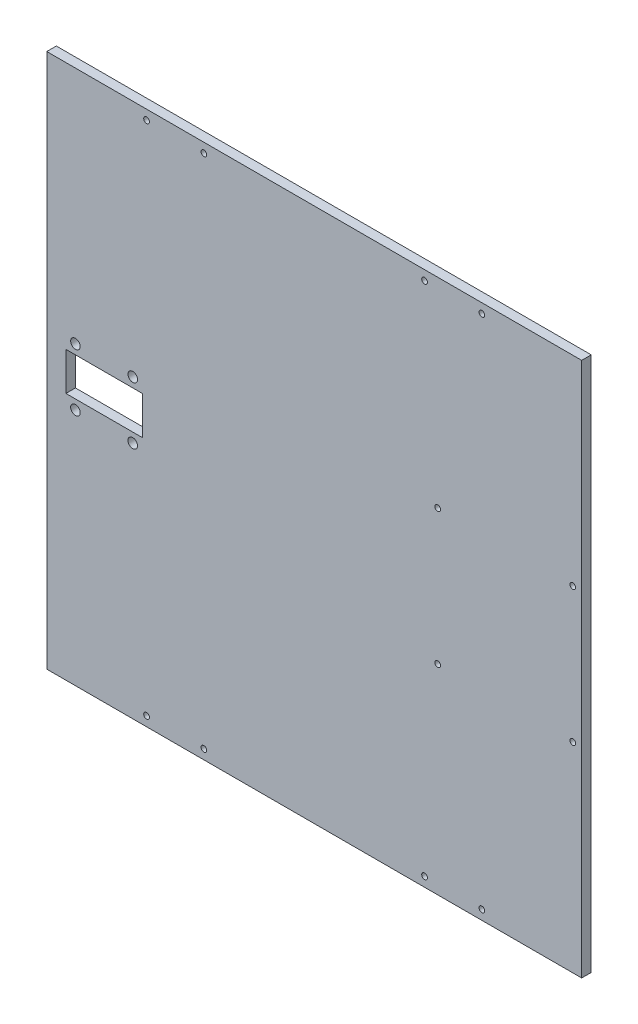
ISO-10303-21;
HEADER;
FILE_DESCRIPTION(('STEP AP214'),'2;1');
FILE_NAME('part.step','',(''),(''),'','','');
FILE_SCHEMA(('AUTOMOTIVE_DESIGN { 1 0 10303 214 1 1 1 1 }'));
ENDSEC;
DATA;
#1=APPLICATION_CONTEXT('core data for automotive mechanical design processes');
#2=APPLICATION_PROTOCOL_DEFINITION('international standard','automotive_design',2000,#1);
#3=PRODUCT_CONTEXT('',#1,'mechanical');
#4=PRODUCT('Part','Part','',(#3));
#5=PRODUCT_RELATED_PRODUCT_CATEGORY('part','',(#4));
#6=PRODUCT_DEFINITION_FORMATION('','',#4);
#7=PRODUCT_DEFINITION_CONTEXT('part definition',#1,'design');
#8=PRODUCT_DEFINITION('design','',#6,#7);
#9=PRODUCT_DEFINITION_SHAPE('','',#8);
#10=(LENGTH_UNIT() NAMED_UNIT(*) SI_UNIT(.MILLI.,.METRE.));
#11=(NAMED_UNIT(*) PLANE_ANGLE_UNIT() SI_UNIT($,.RADIAN.));
#12=(NAMED_UNIT(*) SI_UNIT($,.STERADIAN.) SOLID_ANGLE_UNIT());
#13=UNCERTAINTY_MEASURE_WITH_UNIT(LENGTH_MEASURE(1.E-05),#10,'distance_accuracy_value','');
#14=(GEOMETRIC_REPRESENTATION_CONTEXT(3) GLOBAL_UNCERTAINTY_ASSIGNED_CONTEXT((#13)) GLOBAL_UNIT_ASSIGNED_CONTEXT((#10,
#11,#12)) REPRESENTATION_CONTEXT('',''));
#15=CARTESIAN_POINT('',(0.,0.,0.));
#16=DIRECTION('',(0.,0.,1.));
#17=DIRECTION('',(1.,0.,0.));
#18=AXIS2_PLACEMENT_3D('',#15,#16,#17);
#19=CARTESIAN_POINT('',(0.,0.,5.));
#20=DIRECTION('',(0.,0.,-1.));
#21=DIRECTION('',(-1.,0.,0.));
#22=AXIS2_PLACEMENT_3D('',#19,#20,#21);
#23=PLANE('',#22);
#24=CARTESIAN_POINT('',(-95.,-15.,5.));
#25=DIRECTION('',(0.,0.,1.));
#26=DIRECTION('',(1.,0.,0.));
#27=AXIS2_PLACEMENT_3D('',#24,#25,#26);
#28=CIRCLE('',#27,2.49999999999999);
#29=CARTESIAN_POINT('',(-92.5,-15.,5.));
#30=VERTEX_POINT('',#29);
#31=EDGE_CURVE('E137',#30,#30,#28,.T.);
#32=ORIENTED_EDGE('',*,*,#31,.F.);
#33=EDGE_LOOP('',(#32));
#34=FACE_BOUND('',#33,.T.);
#35=CARTESIAN_POINT('',(-125.,-15.,5.));
#36=DIRECTION('',(0.,0.,1.));
#37=DIRECTION('',(1.,0.,0.));
#38=AXIS2_PLACEMENT_3D('',#35,#36,#37);
#39=CIRCLE('',#38,2.5);
#40=CARTESIAN_POINT('',(-122.5,-15.,5.));
#41=VERTEX_POINT('',#40);
#42=EDGE_CURVE('E143',#41,#41,#39,.T.);
#43=ORIENTED_EDGE('',*,*,#42,.F.);
#44=EDGE_LOOP('',(#43));
#45=FACE_BOUND('',#44,.T.);
#46=CARTESIAN_POINT('',(-125.,15.,5.));
#47=DIRECTION('',(0.,0.,1.));
#48=DIRECTION('',(1.,0.,0.));
#49=AXIS2_PLACEMENT_3D('',#46,#47,#48);
#50=CIRCLE('',#49,2.5);
#51=CARTESIAN_POINT('',(-122.5,15.,5.));
#52=VERTEX_POINT('',#51);
#53=EDGE_CURVE('E149',#52,#52,#50,.T.);
#54=ORIENTED_EDGE('',*,*,#53,.F.);
#55=EDGE_LOOP('',(#54));
#56=FACE_BOUND('',#55,.T.);
#57=CARTESIAN_POINT('',(-95.,15.,5.));
#58=DIRECTION('',(0.,0.,1.));
#59=DIRECTION('',(1.,0.,0.));
#60=AXIS2_PLACEMENT_3D('',#57,#58,#59);
#61=CIRCLE('',#60,2.50000000000001);
#62=CARTESIAN_POINT('',(-92.5,15.,5.));
#63=VERTEX_POINT('',#62);
#64=EDGE_CURVE('E155',#63,#63,#61,.T.);
#65=ORIENTED_EDGE('',*,*,#64,.F.);
#66=EDGE_LOOP('',(#65));
#67=FACE_BOUND('',#66,.T.);
#68=CARTESIAN_POINT('',(135.355339059327,-35.3553390593273,5.));
#69=DIRECTION('',(0.,0.,1.));
#70=DIRECTION('',(1.,0.,0.));
#71=AXIS2_PLACEMENT_3D('',#68,#69,#70);
#72=CIRCLE('',#71,1.5);
#73=CARTESIAN_POINT('',(136.855339059327,-35.3553390593273,5.));
#74=VERTEX_POINT('',#73);
#75=EDGE_CURVE('E161',#74,#74,#72,.T.);
#76=ORIENTED_EDGE('',*,*,#75,.F.);
#77=EDGE_LOOP('',(#76));
#78=FACE_BOUND('',#77,.T.);
#79=CARTESIAN_POINT('',(64.6446609406726,-35.3553390593274,5.));
#80=DIRECTION('',(0.,0.,1.));
#81=DIRECTION('',(1.,0.,0.));
#82=AXIS2_PLACEMENT_3D('',#79,#80,#81);
#83=CIRCLE('',#82,1.5);
#84=CARTESIAN_POINT('',(66.1446609406726,-35.3553390593274,5.));
#85=VERTEX_POINT('',#84);
#86=EDGE_CURVE('E167',#85,#85,#83,.T.);
#87=ORIENTED_EDGE('',*,*,#86,.F.);
#88=EDGE_LOOP('',(#87));
#89=FACE_BOUND('',#88,.T.);
#90=CARTESIAN_POINT('',(64.6446609406726,35.3553390593274,5.));
#91=DIRECTION('',(0.,0.,1.));
#92=DIRECTION('',(1.,0.,0.));
#93=AXIS2_PLACEMENT_3D('',#90,#91,#92);
#94=CIRCLE('',#93,1.5);
#95=CARTESIAN_POINT('',(66.1446609406726,35.3553390593274,5.));
#96=VERTEX_POINT('',#95);
#97=EDGE_CURVE('E173',#96,#96,#94,.T.);
#98=ORIENTED_EDGE('',*,*,#97,.F.);
#99=EDGE_LOOP('',(#98));
#100=FACE_BOUND('',#99,.T.);
#101=CARTESIAN_POINT('',(135.355339059327,35.3553390593274,5.));
#102=DIRECTION('',(0.,0.,1.));
#103=DIRECTION('',(1.,0.,0.));
#104=AXIS2_PLACEMENT_3D('',#101,#102,#103);
#105=CIRCLE('',#104,1.5);
#106=CARTESIAN_POINT('',(136.855339059327,35.3553390593274,5.));
#107=VERTEX_POINT('',#106);
#108=EDGE_CURVE('E179',#107,#107,#105,.T.);
#109=ORIENTED_EDGE('',*,*,#108,.F.);
#110=EDGE_LOOP('',(#109));
#111=FACE_BOUND('',#110,.T.);
#112=CARTESIAN_POINT('',(-87.76,-135.,5.));
#113=DIRECTION('',(0.,0.,1.));
#114=DIRECTION('',(-1.,0.,0.));
#115=AXIS2_PLACEMENT_3D('',#112,#113,#114);
#116=CIRCLE('',#115,1.5);
#117=CARTESIAN_POINT('',(-89.26,-135.,5.));
#118=VERTEX_POINT('',#117);
#119=EDGE_CURVE('E185',#118,#118,#116,.T.);
#120=ORIENTED_EDGE('',*,*,#119,.F.);
#121=EDGE_LOOP('',(#120));
#122=FACE_BOUND('',#121,.T.);
#123=CARTESIAN_POINT('',(-57.76,-135.,5.));
#124=DIRECTION('',(0.,0.,1.));
#125=DIRECTION('',(-1.,0.,0.));
#126=AXIS2_PLACEMENT_3D('',#123,#124,#125);
#127=CIRCLE('',#126,1.5);
#128=CARTESIAN_POINT('',(-59.26,-135.,5.));
#129=VERTEX_POINT('',#128);
#130=EDGE_CURVE('E191',#129,#129,#127,.T.);
#131=ORIENTED_EDGE('',*,*,#130,.F.);
#132=EDGE_LOOP('',(#131));
#133=FACE_BOUND('',#132,.T.);
#134=CARTESIAN_POINT('',(57.76,-135.,5.));
#135=DIRECTION('',(0.,0.,1.));
#136=DIRECTION('',(1.,0.,0.));
#137=AXIS2_PLACEMENT_3D('',#134,#135,#136);
#138=CIRCLE('',#137,1.5);
#139=CARTESIAN_POINT('',(59.26,-135.,5.));
#140=VERTEX_POINT('',#139);
#141=EDGE_CURVE('E197',#140,#140,#138,.T.);
#142=ORIENTED_EDGE('',*,*,#141,.F.);
#143=EDGE_LOOP('',(#142));
#144=FACE_BOUND('',#143,.T.);
#145=CARTESIAN_POINT('',(87.76,-135.,5.));
#146=DIRECTION('',(0.,0.,1.));
#147=DIRECTION('',(1.,0.,0.));
#148=AXIS2_PLACEMENT_3D('',#145,#146,#147);
#149=CIRCLE('',#148,1.5);
#150=CARTESIAN_POINT('',(89.26,-135.,5.));
#151=VERTEX_POINT('',#150);
#152=EDGE_CURVE('E203',#151,#151,#149,.T.);
#153=ORIENTED_EDGE('',*,*,#152,.F.);
#154=EDGE_LOOP('',(#153));
#155=FACE_BOUND('',#154,.T.);
#156=CARTESIAN_POINT('',(87.76,135.,5.));
#157=DIRECTION('',(0.,0.,1.));
#158=DIRECTION('',(-1.,0.,0.));
#159=AXIS2_PLACEMENT_3D('',#156,#157,#158);
#160=CIRCLE('',#159,1.5);
#161=CARTESIAN_POINT('',(86.26,135.,5.));
#162=VERTEX_POINT('',#161);
#163=EDGE_CURVE('E209',#162,#162,#160,.T.);
#164=ORIENTED_EDGE('',*,*,#163,.F.);
#165=EDGE_LOOP('',(#164));
#166=FACE_BOUND('',#165,.T.);
#167=CARTESIAN_POINT('',(57.76,135.,5.));
#168=DIRECTION('',(0.,0.,1.));
#169=DIRECTION('',(-1.,0.,0.));
#170=AXIS2_PLACEMENT_3D('',#167,#168,#169);
#171=CIRCLE('',#170,1.5);
#172=CARTESIAN_POINT('',(56.26,135.,5.));
#173=VERTEX_POINT('',#172);
#174=EDGE_CURVE('E215',#173,#173,#171,.T.);
#175=ORIENTED_EDGE('',*,*,#174,.F.);
#176=EDGE_LOOP('',(#175));
#177=FACE_BOUND('',#176,.T.);
#178=CARTESIAN_POINT('',(-57.76,135.,5.));
#179=DIRECTION('',(0.,0.,1.));
#180=DIRECTION('',(1.,0.,0.));
#181=AXIS2_PLACEMENT_3D('',#178,#179,#180);
#182=CIRCLE('',#181,1.5);
#183=CARTESIAN_POINT('',(-56.26,135.,5.));
#184=VERTEX_POINT('',#183);
#185=EDGE_CURVE('E221',#184,#184,#182,.T.);
#186=ORIENTED_EDGE('',*,*,#185,.F.);
#187=EDGE_LOOP('',(#186));
#188=FACE_BOUND('',#187,.T.);
#189=CARTESIAN_POINT('',(-87.76,135.,5.));
#190=DIRECTION('',(0.,0.,1.));
#191=DIRECTION('',(1.,0.,0.));
#192=AXIS2_PLACEMENT_3D('',#189,#190,#191);
#193=CIRCLE('',#192,1.5);
#194=CARTESIAN_POINT('',(-86.26,135.,5.));
#195=VERTEX_POINT('',#194);
#196=EDGE_CURVE('E227',#195,#195,#193,.T.);
#197=ORIENTED_EDGE('',*,*,#196,.F.);
#198=EDGE_LOOP('',(#197));
#199=FACE_BOUND('',#198,.T.);
#200=DIRECTION('',(0.,1.,0.));
#201=VECTOR('',#200,1.);
#202=CARTESIAN_POINT('',(140.,-140.,5.));
#203=LINE('',#202,#201);
#204=CARTESIAN_POINT('',(140.,-140.,5.));
#205=VERTEX_POINT('',#204);
#206=CARTESIAN_POINT('',(140.,140.,5.));
#207=VERTEX_POINT('',#206);
#208=EDGE_CURVE('E233',#205,#207,#203,.T.);
#209=ORIENTED_EDGE('',*,*,#208,.T.);
#210=DIRECTION('',(-1.,0.,0.));
#211=VECTOR('',#210,1.);
#212=CARTESIAN_POINT('',(-140.,140.,5.));
#213=LINE('',#212,#211);
#214=CARTESIAN_POINT('',(-140.,140.,5.));
#215=VERTEX_POINT('',#214);
#216=EDGE_CURVE('E236',#207,#215,#213,.T.);
#217=ORIENTED_EDGE('',*,*,#216,.T.);
#218=DIRECTION('',(0.,-1.,0.));
#219=VECTOR('',#218,1.);
#220=CARTESIAN_POINT('',(-140.,-140.,5.));
#221=LINE('',#220,#219);
#222=CARTESIAN_POINT('',(-140.,-140.,5.));
#223=VERTEX_POINT('',#222);
#224=EDGE_CURVE('E239',#215,#223,#221,.T.);
#225=ORIENTED_EDGE('',*,*,#224,.T.);
#226=DIRECTION('',(1.,0.,0.));
#227=VECTOR('',#226,1.);
#228=CARTESIAN_POINT('',(-140.,-140.,5.));
#229=LINE('',#228,#227);
#230=EDGE_CURVE('E241',#223,#205,#229,.T.);
#231=ORIENTED_EDGE('',*,*,#230,.T.);
#232=EDGE_LOOP('',(#209,#217,#225,#231));
#233=FACE_BOUND('',#232,.T.);
#234=DIRECTION('',(0.,1.,0.));
#235=VECTOR('',#234,1.);
#236=CARTESIAN_POINT('',(-90.,9.99999999999999,5.));
#237=LINE('',#236,#235);
#238=CARTESIAN_POINT('',(-90.,-10.,5.));
#239=VERTEX_POINT('',#238);
#240=CARTESIAN_POINT('',(-90.,9.99999999999999,5.));
#241=VERTEX_POINT('',#240);
#242=EDGE_CURVE('E101',#239,#241,#237,.T.);
#243=ORIENTED_EDGE('',*,*,#242,.F.);
#244=DIRECTION('',(1.,0.,0.));
#245=VECTOR('',#244,1.);
#246=CARTESIAN_POINT('',(-90.,-10.,5.));
#247=LINE('',#246,#245);
#248=CARTESIAN_POINT('',(-130.,-10.,5.));
#249=VERTEX_POINT('',#248);
#250=EDGE_CURVE('E123',#249,#239,#247,.T.);
#251=ORIENTED_EDGE('',*,*,#250,.F.);
#252=DIRECTION('',(0.,-1.,0.));
#253=VECTOR('',#252,1.);
#254=CARTESIAN_POINT('',(-130.,9.99999999999998,5.));
#255=LINE('',#254,#253);
#256=CARTESIAN_POINT('',(-130.,9.99999999999998,5.));
#257=VERTEX_POINT('',#256);
#258=EDGE_CURVE('E121',#257,#249,#255,.T.);
#259=ORIENTED_EDGE('',*,*,#258,.F.);
#260=DIRECTION('',(-1.,0.,0.));
#261=VECTOR('',#260,1.);
#262=CARTESIAN_POINT('',(-90.,9.99999999999999,5.));
#263=LINE('',#262,#261);
#264=EDGE_CURVE('E109',#241,#257,#263,.T.);
#265=ORIENTED_EDGE('',*,*,#264,.F.);
#266=EDGE_LOOP('',(#243,#251,#259,#265));
#267=FACE_BOUND('',#266,.T.);
#268=ADVANCED_FACE('F36',(#34,#45,#56,#67,#78,#89,#100,#111,#122,#133,#144,#155,#166,#177,#188,
#199,#233,#267),#23,.F.);
#269=CARTESIAN_POINT('',(0.,0.,0.));
#270=DIRECTION('',(0.,0.,-1.));
#271=DIRECTION('',(-1.,0.,0.));
#272=AXIS2_PLACEMENT_3D('',#269,#270,#271);
#273=PLANE('',#272);
#274=CARTESIAN_POINT('',(-125.,-15.,0.));
#275=DIRECTION('',(0.,0.,1.));
#276=DIRECTION('',(1.,0.,0.));
#277=AXIS2_PLACEMENT_3D('',#274,#275,#276);
#278=CIRCLE('',#277,2.5);
#279=CARTESIAN_POINT('',(-122.5,-15.,0.));
#280=VERTEX_POINT('',#279);
#281=EDGE_CURVE('E140',#280,#280,#278,.T.);
#282=ORIENTED_EDGE('',*,*,#281,.T.);
#283=EDGE_LOOP('',(#282));
#284=FACE_BOUND('',#283,.T.);
#285=CARTESIAN_POINT('',(-95.,15.,0.));
#286=DIRECTION('',(0.,0.,1.));
#287=DIRECTION('',(1.,0.,0.));
#288=AXIS2_PLACEMENT_3D('',#285,#286,#287);
#289=CIRCLE('',#288,2.50000000000001);
#290=CARTESIAN_POINT('',(-92.5,15.,0.));
#291=VERTEX_POINT('',#290);
#292=EDGE_CURVE('E152',#291,#291,#289,.T.);
#293=ORIENTED_EDGE('',*,*,#292,.T.);
#294=EDGE_LOOP('',(#293));
#295=FACE_BOUND('',#294,.T.);
#296=CARTESIAN_POINT('',(64.6446609406726,-35.3553390593274,0.));
#297=DIRECTION('',(0.,0.,1.));
#298=DIRECTION('',(1.,0.,0.));
#299=AXIS2_PLACEMENT_3D('',#296,#297,#298);
#300=CIRCLE('',#299,1.5);
#301=CARTESIAN_POINT('',(66.1446609406726,-35.3553390593274,0.));
#302=VERTEX_POINT('',#301);
#303=EDGE_CURVE('E164',#302,#302,#300,.T.);
#304=ORIENTED_EDGE('',*,*,#303,.T.);
#305=EDGE_LOOP('',(#304));
#306=FACE_BOUND('',#305,.T.);
#307=CARTESIAN_POINT('',(135.355339059327,35.3553390593274,0.));
#308=DIRECTION('',(0.,0.,1.));
#309=DIRECTION('',(1.,0.,0.));
#310=AXIS2_PLACEMENT_3D('',#307,#308,#309);
#311=CIRCLE('',#310,1.5);
#312=CARTESIAN_POINT('',(136.855339059327,35.3553390593274,0.));
#313=VERTEX_POINT('',#312);
#314=EDGE_CURVE('E176',#313,#313,#311,.T.);
#315=ORIENTED_EDGE('',*,*,#314,.T.);
#316=EDGE_LOOP('',(#315));
#317=FACE_BOUND('',#316,.T.);
#318=CARTESIAN_POINT('',(-57.76,-135.,0.));
#319=DIRECTION('',(0.,0.,1.));
#320=DIRECTION('',(-1.,0.,0.));
#321=AXIS2_PLACEMENT_3D('',#318,#319,#320);
#322=CIRCLE('',#321,1.5);
#323=CARTESIAN_POINT('',(-59.26,-135.,0.));
#324=VERTEX_POINT('',#323);
#325=EDGE_CURVE('E188',#324,#324,#322,.T.);
#326=ORIENTED_EDGE('',*,*,#325,.T.);
#327=EDGE_LOOP('',(#326));
#328=FACE_BOUND('',#327,.T.);
#329=CARTESIAN_POINT('',(87.76,-135.,0.));
#330=DIRECTION('',(0.,0.,1.));
#331=DIRECTION('',(1.,0.,0.));
#332=AXIS2_PLACEMENT_3D('',#329,#330,#331);
#333=CIRCLE('',#332,1.5);
#334=CARTESIAN_POINT('',(89.26,-135.,0.));
#335=VERTEX_POINT('',#334);
#336=EDGE_CURVE('E200',#335,#335,#333,.T.);
#337=ORIENTED_EDGE('',*,*,#336,.T.);
#338=EDGE_LOOP('',(#337));
#339=FACE_BOUND('',#338,.T.);
#340=CARTESIAN_POINT('',(57.76,135.,0.));
#341=DIRECTION('',(0.,0.,1.));
#342=DIRECTION('',(-1.,0.,0.));
#343=AXIS2_PLACEMENT_3D('',#340,#341,#342);
#344=CIRCLE('',#343,1.5);
#345=CARTESIAN_POINT('',(56.26,135.,0.));
#346=VERTEX_POINT('',#345);
#347=EDGE_CURVE('E212',#346,#346,#344,.T.);
#348=ORIENTED_EDGE('',*,*,#347,.T.);
#349=EDGE_LOOP('',(#348));
#350=FACE_BOUND('',#349,.T.);
#351=CARTESIAN_POINT('',(-87.76,135.,0.));
#352=DIRECTION('',(0.,0.,1.));
#353=DIRECTION('',(1.,0.,0.));
#354=AXIS2_PLACEMENT_3D('',#351,#352,#353);
#355=CIRCLE('',#354,1.5);
#356=CARTESIAN_POINT('',(-86.26,135.,0.));
#357=VERTEX_POINT('',#356);
#358=EDGE_CURVE('E224',#357,#357,#355,.T.);
#359=ORIENTED_EDGE('',*,*,#358,.T.);
#360=EDGE_LOOP('',(#359));
#361=FACE_BOUND('',#360,.T.);
#362=DIRECTION('',(0.,1.,0.));
#363=VECTOR('',#362,1.);
#364=CARTESIAN_POINT('',(140.,-140.,0.));
#365=LINE('',#364,#363);
#366=CARTESIAN_POINT('',(140.,-140.,0.));
#367=VERTEX_POINT('',#366);
#368=CARTESIAN_POINT('',(140.,140.,0.));
#369=VERTEX_POINT('',#368);
#370=EDGE_CURVE('E230',#367,#369,#365,.T.);
#371=ORIENTED_EDGE('',*,*,#370,.F.);
#372=DIRECTION('',(1.,0.,0.));
#373=VECTOR('',#372,1.);
#374=CARTESIAN_POINT('',(-140.,-140.,0.));
#375=LINE('',#374,#373);
#376=CARTESIAN_POINT('',(-140.,-140.,0.));
#377=VERTEX_POINT('',#376);
#378=EDGE_CURVE('E237',#377,#367,#375,.T.);
#379=ORIENTED_EDGE('',*,*,#378,.F.);
#380=DIRECTION('',(0.,-1.,0.));
#381=VECTOR('',#380,1.);
#382=CARTESIAN_POINT('',(-140.,-140.,0.));
#383=LINE('',#382,#381);
#384=CARTESIAN_POINT('',(-140.,140.,0.));
#385=VERTEX_POINT('',#384);
#386=EDGE_CURVE('E248',#385,#377,#383,.T.);
#387=ORIENTED_EDGE('',*,*,#386,.F.);
#388=DIRECTION('',(-1.,0.,0.));
#389=VECTOR('',#388,1.);
#390=CARTESIAN_POINT('',(-140.,140.,0.));
#391=LINE('',#390,#389);
#392=EDGE_CURVE('E246',#369,#385,#391,.T.);
#393=ORIENTED_EDGE('',*,*,#392,.F.);
#394=EDGE_LOOP('',(#371,#379,#387,#393));
#395=FACE_BOUND('',#394,.T.);
#396=CARTESIAN_POINT('',(-57.76,135.,0.));
#397=DIRECTION('',(0.,0.,1.));
#398=DIRECTION('',(1.,0.,0.));
#399=AXIS2_PLACEMENT_3D('',#396,#397,#398);
#400=CIRCLE('',#399,1.5);
#401=CARTESIAN_POINT('',(-56.26,135.,0.));
#402=VERTEX_POINT('',#401);
#403=EDGE_CURVE('E218',#402,#402,#400,.T.);
#404=ORIENTED_EDGE('',*,*,#403,.T.);
#405=EDGE_LOOP('',(#404));
#406=FACE_BOUND('',#405,.T.);
#407=CARTESIAN_POINT('',(87.76,135.,0.));
#408=DIRECTION('',(0.,0.,1.));
#409=DIRECTION('',(-1.,0.,0.));
#410=AXIS2_PLACEMENT_3D('',#407,#408,#409);
#411=CIRCLE('',#410,1.5);
#412=CARTESIAN_POINT('',(86.26,135.,0.));
#413=VERTEX_POINT('',#412);
#414=EDGE_CURVE('E206',#413,#413,#411,.T.);
#415=ORIENTED_EDGE('',*,*,#414,.T.);
#416=EDGE_LOOP('',(#415));
#417=FACE_BOUND('',#416,.T.);
#418=CARTESIAN_POINT('',(57.76,-135.,0.));
#419=DIRECTION('',(0.,0.,1.));
#420=DIRECTION('',(1.,0.,0.));
#421=AXIS2_PLACEMENT_3D('',#418,#419,#420);
#422=CIRCLE('',#421,1.5);
#423=CARTESIAN_POINT('',(59.26,-135.,0.));
#424=VERTEX_POINT('',#423);
#425=EDGE_CURVE('E194',#424,#424,#422,.T.);
#426=ORIENTED_EDGE('',*,*,#425,.T.);
#427=EDGE_LOOP('',(#426));
#428=FACE_BOUND('',#427,.T.);
#429=CARTESIAN_POINT('',(-87.76,-135.,0.));
#430=DIRECTION('',(0.,0.,1.));
#431=DIRECTION('',(-1.,0.,0.));
#432=AXIS2_PLACEMENT_3D('',#429,#430,#431);
#433=CIRCLE('',#432,1.5);
#434=CARTESIAN_POINT('',(-89.26,-135.,0.));
#435=VERTEX_POINT('',#434);
#436=EDGE_CURVE('E182',#435,#435,#433,.T.);
#437=ORIENTED_EDGE('',*,*,#436,.T.);
#438=EDGE_LOOP('',(#437));
#439=FACE_BOUND('',#438,.T.);
#440=CARTESIAN_POINT('',(64.6446609406726,35.3553390593274,0.));
#441=DIRECTION('',(0.,0.,1.));
#442=DIRECTION('',(1.,0.,0.));
#443=AXIS2_PLACEMENT_3D('',#440,#441,#442);
#444=CIRCLE('',#443,1.5);
#445=CARTESIAN_POINT('',(66.1446609406726,35.3553390593274,0.));
#446=VERTEX_POINT('',#445);
#447=EDGE_CURVE('E170',#446,#446,#444,.T.);
#448=ORIENTED_EDGE('',*,*,#447,.T.);
#449=EDGE_LOOP('',(#448));
#450=FACE_BOUND('',#449,.T.);
#451=CARTESIAN_POINT('',(135.355339059327,-35.3553390593273,0.));
#452=DIRECTION('',(0.,0.,1.));
#453=DIRECTION('',(1.,0.,0.));
#454=AXIS2_PLACEMENT_3D('',#451,#452,#453);
#455=CIRCLE('',#454,1.5);
#456=CARTESIAN_POINT('',(136.855339059327,-35.3553390593273,0.));
#457=VERTEX_POINT('',#456);
#458=EDGE_CURVE('E158',#457,#457,#455,.T.);
#459=ORIENTED_EDGE('',*,*,#458,.T.);
#460=EDGE_LOOP('',(#459));
#461=FACE_BOUND('',#460,.T.);
#462=CARTESIAN_POINT('',(-125.,15.,0.));
#463=DIRECTION('',(0.,0.,1.));
#464=DIRECTION('',(1.,0.,0.));
#465=AXIS2_PLACEMENT_3D('',#462,#463,#464);
#466=CIRCLE('',#465,2.5);
#467=CARTESIAN_POINT('',(-122.5,15.,0.));
#468=VERTEX_POINT('',#467);
#469=EDGE_CURVE('E146',#468,#468,#466,.T.);
#470=ORIENTED_EDGE('',*,*,#469,.T.);
#471=EDGE_LOOP('',(#470));
#472=FACE_BOUND('',#471,.T.);
#473=CARTESIAN_POINT('',(-95.,-15.,0.));
#474=DIRECTION('',(0.,0.,1.));
#475=DIRECTION('',(1.,0.,0.));
#476=AXIS2_PLACEMENT_3D('',#473,#474,#475);
#477=CIRCLE('',#476,2.49999999999999);
#478=CARTESIAN_POINT('',(-92.5,-15.,0.));
#479=VERTEX_POINT('',#478);
#480=EDGE_CURVE('E117',#479,#479,#477,.T.);
#481=ORIENTED_EDGE('',*,*,#480,.T.);
#482=EDGE_LOOP('',(#481));
#483=FACE_BOUND('',#482,.T.);
#484=DIRECTION('',(1.,0.,0.));
#485=VECTOR('',#484,1.);
#486=CARTESIAN_POINT('',(-90.,-10.,0.));
#487=LINE('',#486,#485);
#488=CARTESIAN_POINT('',(-130.,-10.,0.));
#489=VERTEX_POINT('',#488);
#490=CARTESIAN_POINT('',(-90.,-10.,0.));
#491=VERTEX_POINT('',#490);
#492=EDGE_CURVE('E110',#489,#491,#487,.T.);
#493=ORIENTED_EDGE('',*,*,#492,.T.);
#494=DIRECTION('',(0.,1.,0.));
#495=VECTOR('',#494,1.);
#496=CARTESIAN_POINT('',(-90.,9.99999999999999,0.));
#497=LINE('',#496,#495);
#498=CARTESIAN_POINT('',(-90.,9.99999999999999,0.));
#499=VERTEX_POINT('',#498);
#500=EDGE_CURVE('E59',#491,#499,#497,.T.);
#501=ORIENTED_EDGE('',*,*,#500,.T.);
#502=DIRECTION('',(-1.,0.,0.));
#503=VECTOR('',#502,1.);
#504=CARTESIAN_POINT('',(-90.,9.99999999999999,0.));
#505=LINE('',#504,#503);
#506=CARTESIAN_POINT('',(-130.,9.99999999999998,0.));
#507=VERTEX_POINT('',#506);
#508=EDGE_CURVE('E116',#499,#507,#505,.T.);
#509=ORIENTED_EDGE('',*,*,#508,.T.);
#510=DIRECTION('',(0.,-1.,0.));
#511=VECTOR('',#510,1.);
#512=CARTESIAN_POINT('',(-130.,9.99999999999998,0.));
#513=LINE('',#512,#511);
#514=EDGE_CURVE('E129',#507,#489,#513,.T.);
#515=ORIENTED_EDGE('',*,*,#514,.T.);
#516=EDGE_LOOP('',(#493,#501,#509,#515));
#517=FACE_BOUND('',#516,.T.);
#518=ADVANCED_FACE('F266',(#284,#295,#306,#317,#328,#339,#350,#361,#395,#406,#417,#428,#439,
#450,#461,#472,#483,#517),#273,.T.);
#519=CARTESIAN_POINT('',(140.,-140.,5.));
#520=DIRECTION('',(-1.,0.,0.));
#521=DIRECTION('',(0.,0.,1.));
#522=AXIS2_PLACEMENT_3D('',#519,#520,#521);
#523=PLANE('',#522);
#524=ORIENTED_EDGE('',*,*,#370,.T.);
#525=DIRECTION('',(0.,0.,-1.));
#526=VECTOR('',#525,1.);
#527=CARTESIAN_POINT('',(140.,140.,5.));
#528=LINE('',#527,#526);
#529=EDGE_CURVE('E11',#207,#369,#528,.T.);
#530=ORIENTED_EDGE('',*,*,#529,.F.);
#531=ORIENTED_EDGE('',*,*,#208,.F.);
#532=DIRECTION('',(0.,0.,-1.));
#533=VECTOR('',#532,1.);
#534=CARTESIAN_POINT('',(140.,-140.,5.));
#535=LINE('',#534,#533);
#536=EDGE_CURVE('E243',#205,#367,#535,.T.);
#537=ORIENTED_EDGE('',*,*,#536,.T.);
#538=EDGE_LOOP('',(#524,#530,#531,#537));
#539=FACE_BOUND('',#538,.T.);
#540=ADVANCED_FACE('F38',(#539),#523,.F.);
#541=CARTESIAN_POINT('',(-140.,140.,5.));
#542=DIRECTION('',(0.,-1.,0.));
#543=DIRECTION('',(0.,0.,-1.));
#544=AXIS2_PLACEMENT_3D('',#541,#542,#543);
#545=PLANE('',#544);
#546=ORIENTED_EDGE('',*,*,#392,.T.);
#547=DIRECTION('',(0.,0.,-1.));
#548=VECTOR('',#547,1.);
#549=CARTESIAN_POINT('',(-140.,140.,5.));
#550=LINE('',#549,#548);
#551=EDGE_CURVE('E44',#215,#385,#550,.T.);
#552=ORIENTED_EDGE('',*,*,#551,.F.);
#553=ORIENTED_EDGE('',*,*,#216,.F.);
#554=ORIENTED_EDGE('',*,*,#529,.T.);
#555=EDGE_LOOP('',(#546,#552,#553,#554));
#556=FACE_BOUND('',#555,.T.);
#557=ADVANCED_FACE('F276',(#556),#545,.F.);
#558=CARTESIAN_POINT('',(-140.,-140.,5.));
#559=DIRECTION('',(1.,0.,0.));
#560=DIRECTION('',(0.,0.,-1.));
#561=AXIS2_PLACEMENT_3D('',#558,#559,#560);
#562=PLANE('',#561);
#563=ORIENTED_EDGE('',*,*,#386,.T.);
#564=DIRECTION('',(0.,0.,-1.));
#565=VECTOR('',#564,1.);
#566=CARTESIAN_POINT('',(-140.,-140.,5.));
#567=LINE('',#566,#565);
#568=EDGE_CURVE('E253',#223,#377,#567,.T.);
#569=ORIENTED_EDGE('',*,*,#568,.F.);
#570=ORIENTED_EDGE('',*,*,#224,.F.);
#571=ORIENTED_EDGE('',*,*,#551,.T.);
#572=EDGE_LOOP('',(#563,#569,#570,#571));
#573=FACE_BOUND('',#572,.T.);
#574=ADVANCED_FACE('F260',(#573),#562,.F.);
#575=CARTESIAN_POINT('',(-140.,-140.,5.));
#576=DIRECTION('',(0.,1.,0.));
#577=DIRECTION('',(0.,0.,1.));
#578=AXIS2_PLACEMENT_3D('',#575,#576,#577);
#579=PLANE('',#578);
#580=ORIENTED_EDGE('',*,*,#378,.T.);
#581=ORIENTED_EDGE('',*,*,#536,.F.);
#582=ORIENTED_EDGE('',*,*,#230,.F.);
#583=ORIENTED_EDGE('',*,*,#568,.T.);
#584=EDGE_LOOP('',(#580,#581,#582,#583));
#585=FACE_BOUND('',#584,.T.);
#586=ADVANCED_FACE('F270',(#585),#579,.F.);
#587=CARTESIAN_POINT('',(-87.76,135.,5.));
#588=DIRECTION('',(0.,0.,-1.));
#589=DIRECTION('',(-1.,0.,0.));
#590=AXIS2_PLACEMENT_3D('',#587,#588,#589);
#591=CYLINDRICAL_SURFACE('',#590,1.5);
#592=ORIENTED_EDGE('',*,*,#196,.T.);
#593=EDGE_LOOP('',(#592));
#594=FACE_BOUND('',#593,.T.);
#595=ORIENTED_EDGE('',*,*,#358,.F.);
#596=EDGE_LOOP('',(#595));
#597=FACE_BOUND('',#596,.T.);
#598=ADVANCED_FACE('F294',(#594,#597),#591,.F.);
#599=CARTESIAN_POINT('',(-57.76,135.,5.));
#600=DIRECTION('',(0.,0.,-1.));
#601=DIRECTION('',(-1.,0.,0.));
#602=AXIS2_PLACEMENT_3D('',#599,#600,#601);
#603=CYLINDRICAL_SURFACE('',#602,1.5);
#604=ORIENTED_EDGE('',*,*,#185,.T.);
#605=EDGE_LOOP('',(#604));
#606=FACE_BOUND('',#605,.T.);
#607=ORIENTED_EDGE('',*,*,#403,.F.);
#608=EDGE_LOOP('',(#607));
#609=FACE_BOUND('',#608,.T.);
#610=ADVANCED_FACE('F301',(#606,#609),#603,.F.);
#611=CARTESIAN_POINT('',(57.76,135.,5.));
#612=DIRECTION('',(0.,0.,-1.));
#613=DIRECTION('',(-1.,0.,0.));
#614=AXIS2_PLACEMENT_3D('',#611,#612,#613);
#615=CYLINDRICAL_SURFACE('',#614,1.5);
#616=ORIENTED_EDGE('',*,*,#174,.T.);
#617=EDGE_LOOP('',(#616));
#618=FACE_BOUND('',#617,.T.);
#619=ORIENTED_EDGE('',*,*,#347,.F.);
#620=EDGE_LOOP('',(#619));
#621=FACE_BOUND('',#620,.T.);
#622=ADVANCED_FACE('F306',(#618,#621),#615,.F.);
#623=CARTESIAN_POINT('',(87.76,135.,5.));
#624=DIRECTION('',(0.,0.,-1.));
#625=DIRECTION('',(-1.,0.,0.));
#626=AXIS2_PLACEMENT_3D('',#623,#624,#625);
#627=CYLINDRICAL_SURFACE('',#626,1.5);
#628=ORIENTED_EDGE('',*,*,#163,.T.);
#629=EDGE_LOOP('',(#628));
#630=FACE_BOUND('',#629,.T.);
#631=ORIENTED_EDGE('',*,*,#414,.F.);
#632=EDGE_LOOP('',(#631));
#633=FACE_BOUND('',#632,.T.);
#634=ADVANCED_FACE('F316',(#630,#633),#627,.F.);
#635=CARTESIAN_POINT('',(87.76,-135.,5.));
#636=DIRECTION('',(0.,0.,-1.));
#637=DIRECTION('',(-1.,0.,0.));
#638=AXIS2_PLACEMENT_3D('',#635,#636,#637);
#639=CYLINDRICAL_SURFACE('',#638,1.5);
#640=ORIENTED_EDGE('',*,*,#152,.T.);
#641=EDGE_LOOP('',(#640));
#642=FACE_BOUND('',#641,.T.);
#643=ORIENTED_EDGE('',*,*,#336,.F.);
#644=EDGE_LOOP('',(#643));
#645=FACE_BOUND('',#644,.T.);
#646=ADVANCED_FACE('F323',(#642,#645),#639,.F.);
#647=CARTESIAN_POINT('',(57.76,-135.,5.));
#648=DIRECTION('',(0.,0.,-1.));
#649=DIRECTION('',(-1.,0.,0.));
#650=AXIS2_PLACEMENT_3D('',#647,#648,#649);
#651=CYLINDRICAL_SURFACE('',#650,1.5);
#652=ORIENTED_EDGE('',*,*,#141,.T.);
#653=EDGE_LOOP('',(#652));
#654=FACE_BOUND('',#653,.T.);
#655=ORIENTED_EDGE('',*,*,#425,.F.);
#656=EDGE_LOOP('',(#655));
#657=FACE_BOUND('',#656,.T.);
#658=ADVANCED_FACE('F327',(#654,#657),#651,.F.);
#659=CARTESIAN_POINT('',(-57.76,-135.,5.));
#660=DIRECTION('',(0.,0.,-1.));
#661=DIRECTION('',(-1.,0.,0.));
#662=AXIS2_PLACEMENT_3D('',#659,#660,#661);
#663=CYLINDRICAL_SURFACE('',#662,1.5);
#664=ORIENTED_EDGE('',*,*,#130,.T.);
#665=EDGE_LOOP('',(#664));
#666=FACE_BOUND('',#665,.T.);
#667=ORIENTED_EDGE('',*,*,#325,.F.);
#668=EDGE_LOOP('',(#667));
#669=FACE_BOUND('',#668,.T.);
#670=ADVANCED_FACE('F331',(#666,#669),#663,.F.);
#671=CARTESIAN_POINT('',(-87.76,-135.,5.));
#672=DIRECTION('',(0.,0.,-1.));
#673=DIRECTION('',(-1.,0.,0.));
#674=AXIS2_PLACEMENT_3D('',#671,#672,#673);
#675=CYLINDRICAL_SURFACE('',#674,1.5);
#676=ORIENTED_EDGE('',*,*,#119,.T.);
#677=EDGE_LOOP('',(#676));
#678=FACE_BOUND('',#677,.T.);
#679=ORIENTED_EDGE('',*,*,#436,.F.);
#680=EDGE_LOOP('',(#679));
#681=FACE_BOUND('',#680,.T.);
#682=ADVANCED_FACE('F335',(#678,#681),#675,.F.);
#683=CARTESIAN_POINT('',(135.355339059327,35.3553390593274,5.));
#684=DIRECTION('',(0.,0.,-1.));
#685=DIRECTION('',(-1.,0.,0.));
#686=AXIS2_PLACEMENT_3D('',#683,#684,#685);
#687=CYLINDRICAL_SURFACE('',#686,1.5);
#688=ORIENTED_EDGE('',*,*,#108,.T.);
#689=EDGE_LOOP('',(#688));
#690=FACE_BOUND('',#689,.T.);
#691=ORIENTED_EDGE('',*,*,#314,.F.);
#692=EDGE_LOOP('',(#691));
#693=FACE_BOUND('',#692,.T.);
#694=ADVANCED_FACE('F339',(#690,#693),#687,.F.);
#695=CARTESIAN_POINT('',(64.6446609406726,35.3553390593274,5.));
#696=DIRECTION('',(0.,0.,-1.));
#697=DIRECTION('',(-1.,0.,0.));
#698=AXIS2_PLACEMENT_3D('',#695,#696,#697);
#699=CYLINDRICAL_SURFACE('',#698,1.5);
#700=ORIENTED_EDGE('',*,*,#97,.T.);
#701=EDGE_LOOP('',(#700));
#702=FACE_BOUND('',#701,.T.);
#703=ORIENTED_EDGE('',*,*,#447,.F.);
#704=EDGE_LOOP('',(#703));
#705=FACE_BOUND('',#704,.T.);
#706=ADVANCED_FACE('F343',(#702,#705),#699,.F.);
#707=CARTESIAN_POINT('',(64.6446609406726,-35.3553390593274,5.));
#708=DIRECTION('',(0.,0.,-1.));
#709=DIRECTION('',(-1.,0.,0.));
#710=AXIS2_PLACEMENT_3D('',#707,#708,#709);
#711=CYLINDRICAL_SURFACE('',#710,1.5);
#712=ORIENTED_EDGE('',*,*,#86,.T.);
#713=EDGE_LOOP('',(#712));
#714=FACE_BOUND('',#713,.T.);
#715=ORIENTED_EDGE('',*,*,#303,.F.);
#716=EDGE_LOOP('',(#715));
#717=FACE_BOUND('',#716,.T.);
#718=ADVANCED_FACE('F347',(#714,#717),#711,.F.);
#719=CARTESIAN_POINT('',(135.355339059327,-35.3553390593273,5.));
#720=DIRECTION('',(0.,0.,-1.));
#721=DIRECTION('',(-1.,0.,0.));
#722=AXIS2_PLACEMENT_3D('',#719,#720,#721);
#723=CYLINDRICAL_SURFACE('',#722,1.5);
#724=ORIENTED_EDGE('',*,*,#75,.T.);
#725=EDGE_LOOP('',(#724));
#726=FACE_BOUND('',#725,.T.);
#727=ORIENTED_EDGE('',*,*,#458,.F.);
#728=EDGE_LOOP('',(#727));
#729=FACE_BOUND('',#728,.T.);
#730=ADVANCED_FACE('F351',(#726,#729),#723,.F.);
#731=CARTESIAN_POINT('',(-95.,15.,5.));
#732=DIRECTION('',(0.,0.,-1.));
#733=DIRECTION('',(-1.,0.,0.));
#734=AXIS2_PLACEMENT_3D('',#731,#732,#733);
#735=CYLINDRICAL_SURFACE('',#734,2.50000000000001);
#736=ORIENTED_EDGE('',*,*,#64,.T.);
#737=EDGE_LOOP('',(#736));
#738=FACE_BOUND('',#737,.T.);
#739=ORIENTED_EDGE('',*,*,#292,.F.);
#740=EDGE_LOOP('',(#739));
#741=FACE_BOUND('',#740,.T.);
#742=ADVANCED_FACE('F355',(#738,#741),#735,.F.);
#743=CARTESIAN_POINT('',(-125.,15.,5.));
#744=DIRECTION('',(0.,0.,-1.));
#745=DIRECTION('',(-1.,0.,0.));
#746=AXIS2_PLACEMENT_3D('',#743,#744,#745);
#747=CYLINDRICAL_SURFACE('',#746,2.5);
#748=ORIENTED_EDGE('',*,*,#53,.T.);
#749=EDGE_LOOP('',(#748));
#750=FACE_BOUND('',#749,.T.);
#751=ORIENTED_EDGE('',*,*,#469,.F.);
#752=EDGE_LOOP('',(#751));
#753=FACE_BOUND('',#752,.T.);
#754=ADVANCED_FACE('F359',(#750,#753),#747,.F.);
#755=CARTESIAN_POINT('',(-125.,-15.,5.));
#756=DIRECTION('',(0.,0.,-1.));
#757=DIRECTION('',(-1.,0.,0.));
#758=AXIS2_PLACEMENT_3D('',#755,#756,#757);
#759=CYLINDRICAL_SURFACE('',#758,2.5);
#760=ORIENTED_EDGE('',*,*,#42,.T.);
#761=EDGE_LOOP('',(#760));
#762=FACE_BOUND('',#761,.T.);
#763=ORIENTED_EDGE('',*,*,#281,.F.);
#764=EDGE_LOOP('',(#763));
#765=FACE_BOUND('',#764,.T.);
#766=ADVANCED_FACE('F363',(#762,#765),#759,.F.);
#767=CARTESIAN_POINT('',(-95.,-15.,5.));
#768=DIRECTION('',(0.,0.,-1.));
#769=DIRECTION('',(-1.,0.,0.));
#770=AXIS2_PLACEMENT_3D('',#767,#768,#769);
#771=CYLINDRICAL_SURFACE('',#770,2.49999999999999);
#772=ORIENTED_EDGE('',*,*,#31,.T.);
#773=EDGE_LOOP('',(#772));
#774=FACE_BOUND('',#773,.T.);
#775=ORIENTED_EDGE('',*,*,#480,.F.);
#776=EDGE_LOOP('',(#775));
#777=FACE_BOUND('',#776,.T.);
#778=ADVANCED_FACE('F367',(#774,#777),#771,.F.);
#779=CARTESIAN_POINT('',(-90.,9.99999999999999,5.));
#780=DIRECTION('',(-1.,0.,0.));
#781=DIRECTION('',(0.,0.,1.));
#782=AXIS2_PLACEMENT_3D('',#779,#780,#781);
#783=PLANE('',#782);
#784=ORIENTED_EDGE('',*,*,#500,.F.);
#785=DIRECTION('',(0.,0.,-1.));
#786=VECTOR('',#785,1.);
#787=CARTESIAN_POINT('',(-90.,-10.,5.));
#788=LINE('',#787,#786);
#789=EDGE_CURVE('E105',#239,#491,#788,.T.);
#790=ORIENTED_EDGE('',*,*,#789,.F.);
#791=ORIENTED_EDGE('',*,*,#242,.T.);
#792=DIRECTION('',(0.,0.,-1.));
#793=VECTOR('',#792,1.);
#794=CARTESIAN_POINT('',(-90.,9.99999999999999,5.));
#795=LINE('',#794,#793);
#796=EDGE_CURVE('E104',#241,#499,#795,.T.);
#797=ORIENTED_EDGE('',*,*,#796,.T.);
#798=EDGE_LOOP('',(#784,#790,#791,#797));
#799=FACE_BOUND('',#798,.T.);
#800=ADVANCED_FACE('F103',(#799),#783,.T.);
#801=CARTESIAN_POINT('',(-90.,9.99999999999999,5.));
#802=DIRECTION('',(0.,-1.,0.));
#803=DIRECTION('',(1.,0.,0.));
#804=AXIS2_PLACEMENT_3D('',#801,#802,#803);
#805=PLANE('',#804);
#806=ORIENTED_EDGE('',*,*,#508,.F.);
#807=ORIENTED_EDGE('',*,*,#796,.F.);
#808=ORIENTED_EDGE('',*,*,#264,.T.);
#809=DIRECTION('',(0.,0.,-1.));
#810=VECTOR('',#809,1.);
#811=CARTESIAN_POINT('',(-130.,9.99999999999998,5.));
#812=LINE('',#811,#810);
#813=EDGE_CURVE('E118',#257,#507,#812,.T.);
#814=ORIENTED_EDGE('',*,*,#813,.T.);
#815=EDGE_LOOP('',(#806,#807,#808,#814));
#816=FACE_BOUND('',#815,.T.);
#817=ADVANCED_FACE('F113',(#816),#805,.T.);
#818=CARTESIAN_POINT('',(-130.,9.99999999999998,5.));
#819=DIRECTION('',(1.,0.,0.));
#820=DIRECTION('',(0.,0.,-1.));
#821=AXIS2_PLACEMENT_3D('',#818,#819,#820);
#822=PLANE('',#821);
#823=ORIENTED_EDGE('',*,*,#514,.F.);
#824=ORIENTED_EDGE('',*,*,#813,.F.);
#825=ORIENTED_EDGE('',*,*,#258,.T.);
#826=DIRECTION('',(0.,0.,-1.));
#827=VECTOR('',#826,1.);
#828=CARTESIAN_POINT('',(-130.,-10.,5.));
#829=LINE('',#828,#827);
#830=EDGE_CURVE('E51',#249,#489,#829,.T.);
#831=ORIENTED_EDGE('',*,*,#830,.T.);
#832=EDGE_LOOP('',(#823,#824,#825,#831));
#833=FACE_BOUND('',#832,.T.);
#834=ADVANCED_FACE('F376',(#833),#822,.T.);
#835=CARTESIAN_POINT('',(-90.,-10.,5.));
#836=DIRECTION('',(0.,1.,0.));
#837=DIRECTION('',(-1.,0.,0.));
#838=AXIS2_PLACEMENT_3D('',#835,#836,#837);
#839=PLANE('',#838);
#840=ORIENTED_EDGE('',*,*,#492,.F.);
#841=ORIENTED_EDGE('',*,*,#830,.F.);
#842=ORIENTED_EDGE('',*,*,#250,.T.);
#843=ORIENTED_EDGE('',*,*,#789,.T.);
#844=EDGE_LOOP('',(#840,#841,#842,#843));
#845=FACE_BOUND('',#844,.T.);
#846=ADVANCED_FACE('F379',(#845),#839,.T.);
#847=CLOSED_SHELL('',(#268,#518,#540,#557,#574,#586,#598,#610,#622,#634,#646,#658,#670,#682,
#694,#706,#718,#730,#742,#754,#766,#778,#800,#817,#834,#846));
#848=MANIFOLD_SOLID_BREP('B2',#847);
#849=ADVANCED_BREP_SHAPE_REPRESENTATION('',(#18,#848),#14);
#850=SHAPE_DEFINITION_REPRESENTATION(#9,#849);
ENDSEC;
END-ISO-10303-21;
